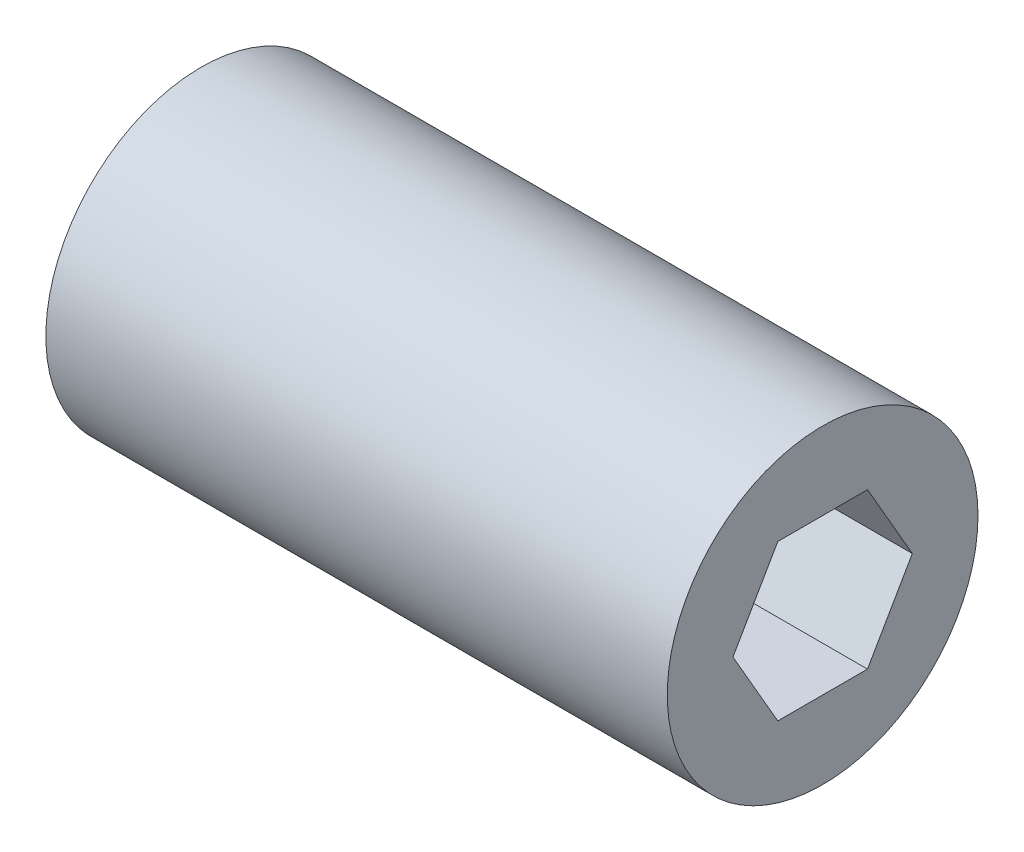
ISO-10303-21;
HEADER;
FILE_DESCRIPTION(('STEP AP214'),'2;1');
FILE_NAME('part.step','',(''),(''),'','','');
FILE_SCHEMA(('AUTOMOTIVE_DESIGN { 1 0 10303 214 1 1 1 1 }'));
ENDSEC;
DATA;
#1=APPLICATION_CONTEXT('core data for automotive mechanical design processes');
#2=APPLICATION_PROTOCOL_DEFINITION('international standard','automotive_design',2000,#1);
#3=PRODUCT_CONTEXT('',#1,'mechanical');
#4=PRODUCT('Part','Part','',(#3));
#5=PRODUCT_RELATED_PRODUCT_CATEGORY('part','',(#4));
#6=PRODUCT_DEFINITION_FORMATION('','',#4);
#7=PRODUCT_DEFINITION_CONTEXT('part definition',#1,'design');
#8=PRODUCT_DEFINITION('design','',#6,#7);
#9=PRODUCT_DEFINITION_SHAPE('','',#8);
#10=(LENGTH_UNIT() NAMED_UNIT(*) SI_UNIT(.MILLI.,.METRE.));
#11=(NAMED_UNIT(*) PLANE_ANGLE_UNIT() SI_UNIT($,.RADIAN.));
#12=(NAMED_UNIT(*) SI_UNIT($,.STERADIAN.) SOLID_ANGLE_UNIT());
#13=UNCERTAINTY_MEASURE_WITH_UNIT(LENGTH_MEASURE(1.E-05),#10,'distance_accuracy_value','');
#14=(GEOMETRIC_REPRESENTATION_CONTEXT(3) GLOBAL_UNCERTAINTY_ASSIGNED_CONTEXT((#13)) GLOBAL_UNIT_ASSIGNED_CONTEXT((#10,
#11,#12)) REPRESENTATION_CONTEXT('',''));
#15=CARTESIAN_POINT('',(0.,0.,0.));
#16=DIRECTION('',(0.,0.,1.));
#17=DIRECTION('',(1.,0.,0.));
#18=AXIS2_PLACEMENT_3D('',#15,#16,#17);
#19=CARTESIAN_POINT('',(25.4,0.,0.));
#20=DIRECTION('',(1.,0.,0.));
#21=DIRECTION('',(0.,0.,-1.));
#22=AXIS2_PLACEMENT_3D('',#19,#20,#21);
#23=PLANE('',#22);
#24=CARTESIAN_POINT('',(25.4,0.,0.));
#25=DIRECTION('',(1.,0.,0.));
#26=DIRECTION('',(0.,0.,-1.));
#27=AXIS2_PLACEMENT_3D('',#24,#25,#26);
#28=CIRCLE('',#27,12.7);
#29=CARTESIAN_POINT('',(25.4,0.,-12.7));
#30=VERTEX_POINT('',#29);
#31=EDGE_CURVE('E11',#30,#30,#28,.T.);
#32=ORIENTED_EDGE('',*,*,#31,.T.);
#33=EDGE_LOOP('',(#32));
#34=FACE_BOUND('',#33,.T.);
#35=DIRECTION('',(0.,0.866025403784438,0.500000000000001));
#36=VECTOR('',#35,1.);
#37=CARTESIAN_POINT('',(25.4,0.,-7.33234841870825));
#38=LINE('',#37,#36);
#39=CARTESIAN_POINT('',(25.4,0.,-7.33234841870825));
#40=VERTEX_POINT('',#39);
#41=CARTESIAN_POINT('',(25.4,6.35000000000001,-3.66617420935411));
#42=VERTEX_POINT('',#41);
#43=EDGE_CURVE('E99',#40,#42,#38,.T.);
#44=ORIENTED_EDGE('',*,*,#43,.F.);
#45=DIRECTION('',(0.,0.866025403784441,-0.499999999999995));
#46=VECTOR('',#45,1.);
#47=CARTESIAN_POINT('',(25.4,-6.34999999999996,-3.6661742093542));
#48=LINE('',#47,#46);
#49=CARTESIAN_POINT('',(25.4,-6.34999999999996,-3.6661742093542));
#50=VERTEX_POINT('',#49);
#51=EDGE_CURVE('E91',#50,#40,#48,.T.);
#52=ORIENTED_EDGE('',*,*,#51,.F.);
#53=DIRECTION('',(0.,0.,-1.));
#54=VECTOR('',#53,1.);
#55=CARTESIAN_POINT('',(25.4,-6.35000000000004,3.66617420935407));
#56=LINE('',#55,#54);
#57=CARTESIAN_POINT('',(25.4,-6.35000000000004,3.66617420935407));
#58=VERTEX_POINT('',#57);
#59=EDGE_CURVE('E119',#58,#50,#56,.T.);
#60=ORIENTED_EDGE('',*,*,#59,.F.);
#61=DIRECTION('',(0.,-0.866025403784435,-0.500000000000007));
#62=VECTOR('',#61,1.);
#63=CARTESIAN_POINT('',(25.4,0.,7.33234841870825));
#64=LINE('',#63,#62);
#65=CARTESIAN_POINT('',(25.4,0.,7.33234841870825));
#66=VERTEX_POINT('',#65);
#67=EDGE_CURVE('E117',#66,#58,#64,.T.);
#68=ORIENTED_EDGE('',*,*,#67,.F.);
#69=DIRECTION('',(0.,-0.866025403784442,0.499999999999995));
#70=VECTOR('',#69,1.);
#71=CARTESIAN_POINT('',(25.4,6.34999999999999,3.66617420935416));
#72=LINE('',#71,#70);
#73=CARTESIAN_POINT('',(25.4,6.34999999999999,3.66617420935416));
#74=VERTEX_POINT('',#73);
#75=EDGE_CURVE('E113',#74,#66,#72,.T.);
#76=ORIENTED_EDGE('',*,*,#75,.F.);
#77=DIRECTION('',(0.,0.,1.));
#78=VECTOR('',#77,1.);
#79=CARTESIAN_POINT('',(25.4,6.35000000000001,-3.66617420935411));
#80=LINE('',#79,#78);
#81=EDGE_CURVE('E111',#42,#74,#80,.T.);
#82=ORIENTED_EDGE('',*,*,#81,.F.);
#83=EDGE_LOOP('',(#44,#52,#60,#68,#76,#82));
#84=FACE_BOUND('',#83,.T.);
#85=ADVANCED_FACE('F38',(#34,#84),#23,.T.);
#86=CARTESIAN_POINT('',(-25.4,0.,0.));
#87=DIRECTION('',(1.,0.,0.));
#88=DIRECTION('',(0.,0.,-1.));
#89=AXIS2_PLACEMENT_3D('',#86,#87,#88);
#90=PLANE('',#89);
#91=CARTESIAN_POINT('',(-25.4,0.,0.));
#92=DIRECTION('',(1.,0.,0.));
#93=DIRECTION('',(0.,0.,-1.));
#94=AXIS2_PLACEMENT_3D('',#91,#92,#93);
#95=CIRCLE('',#94,12.7);
#96=CARTESIAN_POINT('',(-25.4,0.,-12.7));
#97=VERTEX_POINT('',#96);
#98=EDGE_CURVE('E42',#97,#97,#95,.T.);
#99=ORIENTED_EDGE('',*,*,#98,.F.);
#100=EDGE_LOOP('',(#99));
#101=FACE_BOUND('',#100,.T.);
#102=DIRECTION('',(0.,0.866025403784441,-0.499999999999995));
#103=VECTOR('',#102,1.);
#104=CARTESIAN_POINT('',(-25.4,-6.34999999999996,-3.6661742093542));
#105=LINE('',#104,#103);
#106=CARTESIAN_POINT('',(-25.4,-6.34999999999996,-3.6661742093542));
#107=VERTEX_POINT('',#106);
#108=CARTESIAN_POINT('',(-25.4,0.,-7.33234841870825));
#109=VERTEX_POINT('',#108);
#110=EDGE_CURVE('E61',#107,#109,#105,.T.);
#111=ORIENTED_EDGE('',*,*,#110,.T.);
#112=DIRECTION('',(0.,0.866025403784438,0.500000000000001));
#113=VECTOR('',#112,1.);
#114=CARTESIAN_POINT('',(-25.4,0.,-7.33234841870825));
#115=LINE('',#114,#113);
#116=CARTESIAN_POINT('',(-25.4,6.35000000000001,-3.66617420935411));
#117=VERTEX_POINT('',#116);
#118=EDGE_CURVE('E106',#109,#117,#115,.T.);
#119=ORIENTED_EDGE('',*,*,#118,.T.);
#120=DIRECTION('',(0.,0.,1.));
#121=VECTOR('',#120,1.);
#122=CARTESIAN_POINT('',(-25.4,6.35000000000001,-3.66617420935411));
#123=LINE('',#122,#121);
#124=CARTESIAN_POINT('',(-25.4,6.34999999999999,3.66617420935416));
#125=VERTEX_POINT('',#124);
#126=EDGE_CURVE('E123',#117,#125,#123,.T.);
#127=ORIENTED_EDGE('',*,*,#126,.T.);
#128=DIRECTION('',(0.,-0.866025403784442,0.499999999999995));
#129=VECTOR('',#128,1.);
#130=CARTESIAN_POINT('',(-25.4,6.34999999999999,3.66617420935416));
#131=LINE('',#130,#129);
#132=CARTESIAN_POINT('',(-25.4,0.,7.33234841870825));
#133=VERTEX_POINT('',#132);
#134=EDGE_CURVE('E126',#125,#133,#131,.T.);
#135=ORIENTED_EDGE('',*,*,#134,.T.);
#136=DIRECTION('',(0.,-0.866025403784435,-0.500000000000007));
#137=VECTOR('',#136,1.);
#138=CARTESIAN_POINT('',(-25.4,0.,7.33234841870825));
#139=LINE('',#138,#137);
#140=CARTESIAN_POINT('',(-25.4,-6.35000000000004,3.66617420935407));
#141=VERTEX_POINT('',#140);
#142=EDGE_CURVE('E129',#133,#141,#139,.T.);
#143=ORIENTED_EDGE('',*,*,#142,.T.);
#144=DIRECTION('',(0.,0.,-1.));
#145=VECTOR('',#144,1.);
#146=CARTESIAN_POINT('',(-25.4,-6.35000000000004,3.66617420935407));
#147=LINE('',#146,#145);
#148=EDGE_CURVE('E100',#141,#107,#147,.T.);
#149=ORIENTED_EDGE('',*,*,#148,.T.);
#150=EDGE_LOOP('',(#111,#119,#127,#135,#143,#149));
#151=FACE_BOUND('',#150,.T.);
#152=ADVANCED_FACE('F146',(#101,#151),#90,.F.);
#153=CARTESIAN_POINT('',(25.4,0.,0.));
#154=DIRECTION('',(-1.,0.,0.));
#155=DIRECTION('',(0.,0.,1.));
#156=AXIS2_PLACEMENT_3D('',#153,#154,#155);
#157=CYLINDRICAL_SURFACE('',#156,12.7);
#158=ORIENTED_EDGE('',*,*,#31,.F.);
#159=EDGE_LOOP('',(#158));
#160=FACE_BOUND('',#159,.T.);
#161=ORIENTED_EDGE('',*,*,#98,.T.);
#162=EDGE_LOOP('',(#161));
#163=FACE_BOUND('',#162,.T.);
#164=ADVANCED_FACE('F40',(#160,#163),#157,.T.);
#165=CARTESIAN_POINT('',(25.4,-6.34999999999996,-3.6661742093542));
#166=DIRECTION('',(0.,0.499999999999995,0.866025403784441));
#167=DIRECTION('',(0.,-0.866025403784441,0.499999999999995));
#168=AXIS2_PLACEMENT_3D('',#165,#166,#167);
#169=PLANE('',#168);
#170=ORIENTED_EDGE('',*,*,#110,.F.);
#171=DIRECTION('',(-1.,0.,0.));
#172=VECTOR('',#171,1.);
#173=CARTESIAN_POINT('',(25.4,-6.34999999999996,-3.6661742093542));
#174=LINE('',#173,#172);
#175=EDGE_CURVE('E95',#50,#107,#174,.T.);
#176=ORIENTED_EDGE('',*,*,#175,.F.);
#177=ORIENTED_EDGE('',*,*,#51,.T.);
#178=DIRECTION('',(-1.,0.,0.));
#179=VECTOR('',#178,1.);
#180=CARTESIAN_POINT('',(25.4,0.,-7.33234841870825));
#181=LINE('',#180,#179);
#182=EDGE_CURVE('E94',#40,#109,#181,.T.);
#183=ORIENTED_EDGE('',*,*,#182,.T.);
#184=EDGE_LOOP('',(#170,#176,#177,#183));
#185=FACE_BOUND('',#184,.T.);
#186=ADVANCED_FACE('F93',(#185),#169,.T.);
#187=CARTESIAN_POINT('',(25.4,0.,-7.33234841870825));
#188=DIRECTION('',(0.,-0.500000000000001,0.866025403784438));
#189=DIRECTION('',(0.,-0.866025403784438,-0.500000000000001));
#190=AXIS2_PLACEMENT_3D('',#187,#188,#189);
#191=PLANE('',#190);
#192=ORIENTED_EDGE('',*,*,#118,.F.);
#193=ORIENTED_EDGE('',*,*,#182,.F.);
#194=ORIENTED_EDGE('',*,*,#43,.T.);
#195=DIRECTION('',(-1.,0.,0.));
#196=VECTOR('',#195,1.);
#197=CARTESIAN_POINT('',(25.4,6.35000000000001,-3.66617420935411));
#198=LINE('',#197,#196);
#199=EDGE_CURVE('E107',#42,#117,#198,.T.);
#200=ORIENTED_EDGE('',*,*,#199,.T.);
#201=EDGE_LOOP('',(#192,#193,#194,#200));
#202=FACE_BOUND('',#201,.T.);
#203=ADVANCED_FACE('F103',(#202),#191,.T.);
#204=CARTESIAN_POINT('',(25.4,6.35000000000001,-3.66617420935411));
#205=DIRECTION('',(0.,-1.,0.));
#206=DIRECTION('',(0.,0.,-1.));
#207=AXIS2_PLACEMENT_3D('',#204,#205,#206);
#208=PLANE('',#207);
#209=ORIENTED_EDGE('',*,*,#126,.F.);
#210=ORIENTED_EDGE('',*,*,#199,.F.);
#211=ORIENTED_EDGE('',*,*,#81,.T.);
#212=DIRECTION('',(-1.,0.,0.));
#213=VECTOR('',#212,1.);
#214=CARTESIAN_POINT('',(25.4,6.34999999999999,3.66617420935416));
#215=LINE('',#214,#213);
#216=EDGE_CURVE('E138',#74,#125,#215,.T.);
#217=ORIENTED_EDGE('',*,*,#216,.T.);
#218=EDGE_LOOP('',(#209,#210,#211,#217));
#219=FACE_BOUND('',#218,.T.);
#220=ADVANCED_FACE('F142',(#219),#208,.T.);
#221=CARTESIAN_POINT('',(25.4,6.34999999999999,3.66617420935416));
#222=DIRECTION('',(0.,-0.499999999999995,-0.866025403784441));
#223=DIRECTION('',(0.,0.866025403784442,-0.499999999999995));
#224=AXIS2_PLACEMENT_3D('',#221,#222,#223);
#225=PLANE('',#224);
#226=ORIENTED_EDGE('',*,*,#134,.F.);
#227=ORIENTED_EDGE('',*,*,#216,.F.);
#228=ORIENTED_EDGE('',*,*,#75,.T.);
#229=DIRECTION('',(-1.,0.,0.));
#230=VECTOR('',#229,1.);
#231=CARTESIAN_POINT('',(25.4,0.,7.33234841870825));
#232=LINE('',#231,#230);
#233=EDGE_CURVE('E136',#66,#133,#232,.T.);
#234=ORIENTED_EDGE('',*,*,#233,.T.);
#235=EDGE_LOOP('',(#226,#227,#228,#234));
#236=FACE_BOUND('',#235,.T.);
#237=ADVANCED_FACE('F154',(#236),#225,.T.);
#238=CARTESIAN_POINT('',(25.4,0.,7.33234841870825));
#239=DIRECTION('',(0.,0.500000000000007,-0.866025403784435));
#240=DIRECTION('',(0.,0.866025403784435,0.500000000000007));
#241=AXIS2_PLACEMENT_3D('',#238,#239,#240);
#242=PLANE('',#241);
#243=ORIENTED_EDGE('',*,*,#142,.F.);
#244=ORIENTED_EDGE('',*,*,#233,.F.);
#245=ORIENTED_EDGE('',*,*,#67,.T.);
#246=DIRECTION('',(-1.,0.,0.));
#247=VECTOR('',#246,1.);
#248=CARTESIAN_POINT('',(25.4,-6.35000000000004,3.66617420935407));
#249=LINE('',#248,#247);
#250=EDGE_CURVE('E53',#58,#141,#249,.T.);
#251=ORIENTED_EDGE('',*,*,#250,.T.);
#252=EDGE_LOOP('',(#243,#244,#245,#251));
#253=FACE_BOUND('',#252,.T.);
#254=ADVANCED_FACE('F152',(#253),#242,.T.);
#255=CARTESIAN_POINT('',(25.4,-6.35000000000004,3.66617420935407));
#256=DIRECTION('',(0.,1.,0.));
#257=DIRECTION('',(0.,0.,1.));
#258=AXIS2_PLACEMENT_3D('',#255,#256,#257);
#259=PLANE('',#258);
#260=ORIENTED_EDGE('',*,*,#148,.F.);
#261=ORIENTED_EDGE('',*,*,#250,.F.);
#262=ORIENTED_EDGE('',*,*,#59,.T.);
#263=ORIENTED_EDGE('',*,*,#175,.T.);
#264=EDGE_LOOP('',(#260,#261,#262,#263));
#265=FACE_BOUND('',#264,.T.);
#266=ADVANCED_FACE('F148',(#265),#259,.T.);
#267=CLOSED_SHELL('',(#85,#152,#164,#186,#203,#220,#237,#254,#266));
#268=MANIFOLD_SOLID_BREP('B2',#267);
#269=ADVANCED_BREP_SHAPE_REPRESENTATION('',(#18,#268),#14);
#270=SHAPE_DEFINITION_REPRESENTATION(#9,#269);
ENDSEC;
END-ISO-10303-21;
